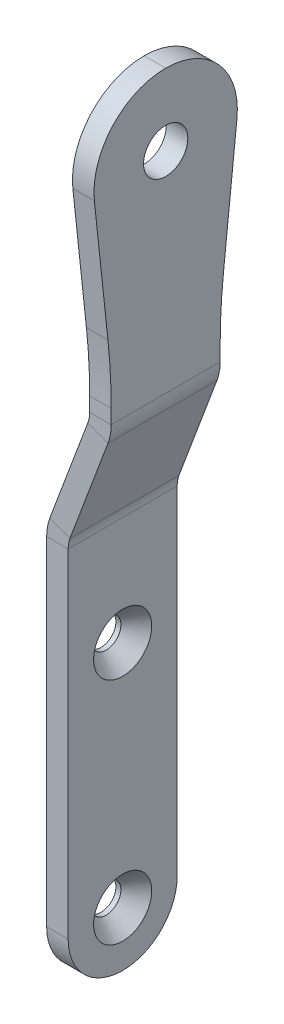
ISO-10303-21;
HEADER;
FILE_DESCRIPTION(('STEP AP214'),'2;1');
FILE_NAME('part.step','',(''),(''),'','','');
FILE_SCHEMA(('AUTOMOTIVE_DESIGN { 1 0 10303 214 1 1 1 1 }'));
ENDSEC;
DATA;
#1=APPLICATION_CONTEXT('core data for automotive mechanical design processes');
#2=APPLICATION_PROTOCOL_DEFINITION('international standard','automotive_design',2000,#1);
#3=PRODUCT_CONTEXT('',#1,'mechanical');
#4=PRODUCT('Part','Part','',(#3));
#5=PRODUCT_RELATED_PRODUCT_CATEGORY('part','',(#4));
#6=PRODUCT_DEFINITION_FORMATION('','',#4);
#7=PRODUCT_DEFINITION_CONTEXT('part definition',#1,'design');
#8=PRODUCT_DEFINITION('design','',#6,#7);
#9=PRODUCT_DEFINITION_SHAPE('','',#8);
#10=(LENGTH_UNIT() NAMED_UNIT(*) SI_UNIT(.MILLI.,.METRE.));
#11=(NAMED_UNIT(*) PLANE_ANGLE_UNIT() SI_UNIT($,.RADIAN.));
#12=(NAMED_UNIT(*) SI_UNIT($,.STERADIAN.) SOLID_ANGLE_UNIT());
#13=UNCERTAINTY_MEASURE_WITH_UNIT(LENGTH_MEASURE(1.E-05),#10,'distance_accuracy_value','');
#14=(GEOMETRIC_REPRESENTATION_CONTEXT(3) GLOBAL_UNCERTAINTY_ASSIGNED_CONTEXT((#13)) GLOBAL_UNIT_ASSIGNED_CONTEXT((#10,
#11,#12)) REPRESENTATION_CONTEXT('',''));
#15=CARTESIAN_POINT('',(0.,0.,0.));
#16=DIRECTION('',(0.,0.,1.));
#17=DIRECTION('',(1.,0.,0.));
#18=AXIS2_PLACEMENT_3D('',#15,#16,#17);
#19=CARTESIAN_POINT('',(-26.4404109289541,4.82859740108271,27.94));
#20=DIRECTION('',(0.,0.,1.));
#21=DIRECTION('',(0.936329177569045,-0.351123441588391,0.));
#22=AXIS2_PLACEMENT_3D('',#19,#20,#21);
#23=PLANE('',#22);
#24=DIRECTION('',(0.936329177569046,-0.351123441588388,0.));
#25=VECTOR('',#24,1.);
#26=CARTESIAN_POINT('',(9.12069027756343,113.221840740169,27.94));
#27=LINE('',#26,#25);
#28=CARTESIAN_POINT('',(9.12069027756344,113.221840740169,27.94));
#29=VERTEX_POINT('',#28);
#30=CARTESIAN_POINT('',(13.579957985736,111.549615349604,27.94));
#31=VERTEX_POINT('',#30);
#32=EDGE_CURVE('E351',#29,#31,#27,.T.);
#33=ORIENTED_EDGE('',*,*,#32,.F.);
#34=DIRECTION('',(0.351123441588392,0.936329177569045,0.));
#35=VECTOR('',#34,1.);
#36=CARTESIAN_POINT('',(0.,88.9,27.94));
#37=LINE('',#36,#35);
#38=CARTESIAN_POINT('',(0.70754201426395,90.7867787047039,27.94));
#39=VERTEX_POINT('',#38);
#40=EDGE_CURVE('E334',#39,#29,#37,.T.);
#41=ORIENTED_EDGE('',*,*,#40,.F.);
#42=DIRECTION('',(-0.936329177569045,0.351123441588391,0.));
#43=VECTOR('',#42,1.);
#44=CARTESIAN_POINT('',(5.16680972243652,89.1145533141392,27.94));
#45=LINE('',#44,#43);
#46=CARTESIAN_POINT('',(5.16680972243652,89.1145533141392,27.94));
#47=VERTEX_POINT('',#46);
#48=EDGE_CURVE('E347',#47,#39,#45,.T.);
#49=ORIENTED_EDGE('',*,*,#48,.F.);
#50=DIRECTION('',(0.351123441588392,0.936329177569045,0.));
#51=VECTOR('',#50,1.);
#52=CARTESIAN_POINT('',(4.45926770817256,87.2277746094353,27.94));
#53=LINE('',#52,#51);
#54=EDGE_CURVE('E58',#47,#31,#53,.T.);
#55=ORIENTED_EDGE('',*,*,#54,.T.);
#56=EDGE_LOOP('',(#33,#41,#49,#55));
#57=FACE_BOUND('',#56,.T.);
#58=ADVANCED_FACE('F43',(#57),#23,.T.);
#59=CARTESIAN_POINT('',(-26.4404109289541,4.82859740108271,3.81));
#60=DIRECTION('',(0.,0.,-1.));
#61=DIRECTION('',(0.351123441588391,0.936329177569045,0.));
#62=AXIS2_PLACEMENT_3D('',#59,#60,#61);
#63=PLANE('',#62);
#64=DIRECTION('',(-0.936329177569046,0.351123441588388,0.));
#65=VECTOR('',#64,1.);
#66=CARTESIAN_POINT('',(13.579957985736,111.549615349604,3.81));
#67=LINE('',#66,#65);
#68=CARTESIAN_POINT('',(13.579957985736,111.549615349604,3.81));
#69=VERTEX_POINT('',#68);
#70=CARTESIAN_POINT('',(9.12069027756343,113.221840740169,3.81));
#71=VERTEX_POINT('',#70);
#72=EDGE_CURVE('E11',#69,#71,#67,.T.);
#73=ORIENTED_EDGE('',*,*,#72,.F.);
#74=DIRECTION('',(-0.351123441588392,-0.936329177569045,0.));
#75=VECTOR('',#74,1.);
#76=CARTESIAN_POINT('',(4.45926770817256,87.2277746094353,3.81));
#77=LINE('',#76,#75);
#78=CARTESIAN_POINT('',(5.16680972243652,89.1145533141392,3.81));
#79=VERTEX_POINT('',#78);
#80=EDGE_CURVE('E66',#69,#79,#77,.T.);
#81=ORIENTED_EDGE('',*,*,#80,.T.);
#82=DIRECTION('',(0.936329177569045,-0.351123441588391,0.));
#83=VECTOR('',#82,1.);
#84=CARTESIAN_POINT('',(0.70754201426395,90.7867787047039,3.81));
#85=LINE('',#84,#83);
#86=CARTESIAN_POINT('',(0.70754201426395,90.7867787047039,3.81));
#87=VERTEX_POINT('',#86);
#88=EDGE_CURVE('E342',#87,#79,#85,.T.);
#89=ORIENTED_EDGE('',*,*,#88,.F.);
#90=DIRECTION('',(-0.351123441588392,-0.936329177569045,0.));
#91=VECTOR('',#90,1.);
#92=CARTESIAN_POINT('',(0.,88.9,3.81));
#93=LINE('',#92,#91);
#94=EDGE_CURVE('E337',#71,#87,#93,.T.);
#95=ORIENTED_EDGE('',*,*,#94,.F.);
#96=EDGE_LOOP('',(#73,#81,#89,#95));
#97=FACE_BOUND('',#96,.T.);
#98=ADVANCED_FACE('F45',(#97),#63,.T.);
#99=CARTESIAN_POINT('',(0.,88.9,31.75));
#100=DIRECTION('',(-0.936329177569045,0.351123441588392,0.));
#101=DIRECTION('',(-0.351123441588392,-0.936329177569045,0.));
#102=AXIS2_PLACEMENT_3D('',#99,#100,#101);
#103=PLANE('',#102);
#104=DIRECTION('',(0.,0.,-1.));
#105=VECTOR('',#104,1.);
#106=CARTESIAN_POINT('',(9.12069027756343,113.221840740169,31.75));
#107=LINE('',#106,#105);
#108=EDGE_CURVE('E202',#29,#71,#107,.T.);
#109=ORIENTED_EDGE('',*,*,#108,.T.);
#110=ORIENTED_EDGE('',*,*,#94,.T.);
#111=DIRECTION('',(0.,0.,-1.));
#112=VECTOR('',#111,1.);
#113=CARTESIAN_POINT('',(0.70754201426395,90.7867787047039,31.75));
#114=LINE('',#113,#112);
#115=EDGE_CURVE('E339',#39,#87,#114,.T.);
#116=ORIENTED_EDGE('',*,*,#115,.F.);
#117=ORIENTED_EDGE('',*,*,#40,.T.);
#118=EDGE_LOOP('',(#109,#110,#116,#117));
#119=FACE_BOUND('',#118,.T.);
#120=ADVANCED_FACE('F361',(#119),#103,.T.);
#121=CARTESIAN_POINT('',(4.45926770817256,87.2277746094353,31.75));
#122=DIRECTION('',(-0.936329177569045,0.351123441588392,0.));
#123=DIRECTION('',(-0.351123441588392,-0.936329177569045,0.));
#124=AXIS2_PLACEMENT_3D('',#121,#122,#123);
#125=PLANE('',#124);
#126=ORIENTED_EDGE('',*,*,#80,.F.);
#127=DIRECTION('',(0.,0.,-1.));
#128=VECTOR('',#127,1.);
#129=CARTESIAN_POINT('',(13.579957985736,111.549615349604,31.75));
#130=LINE('',#129,#128);
#131=EDGE_CURVE('E51',#31,#69,#130,.T.);
#132=ORIENTED_EDGE('',*,*,#131,.F.);
#133=ORIENTED_EDGE('',*,*,#54,.F.);
#134=DIRECTION('',(0.,0.,-1.));
#135=VECTOR('',#134,1.);
#136=CARTESIAN_POINT('',(5.16680972243653,89.1145533141392,31.75));
#137=LINE('',#136,#135);
#138=EDGE_CURVE('E345',#47,#79,#137,.T.);
#139=ORIENTED_EDGE('',*,*,#138,.T.);
#140=EDGE_LOOP('',(#126,#132,#133,#139));
#141=FACE_BOUND('',#140,.T.);
#142=ADVANCED_FACE('F358',(#141),#125,.F.);
#143=CARTESIAN_POINT('',(11.1125,86.8849194600529,3.81));
#144=DIRECTION('',(0.,0.,-1.));
#145=DIRECTION('',(-0.936329177569045,0.351123441588391,0.));
#146=AXIS2_PLACEMENT_3D('',#143,#144,#145);
#147=PLANE('',#146);
#148=ORIENTED_EDGE('',*,*,#88,.T.);
#149=CARTESIAN_POINT('',(11.1125,86.8849194600529,3.81));
#150=DIRECTION('',(0.,0.,1.));
#151=DIRECTION('',(0.936329177569045,-0.351123441588391,0.));
#152=AXIS2_PLACEMENT_3D('',#149,#150,#151);
#153=CIRCLE('',#152,6.35);
#154=CARTESIAN_POINT('',(4.76249999999995,86.8849194600529,3.81));
#155=VERTEX_POINT('',#154);
#156=EDGE_CURVE('E273',#79,#155,#153,.T.);
#157=ORIENTED_EDGE('',*,*,#156,.T.);
#158=DIRECTION('',(-1.,0.,0.));
#159=VECTOR('',#158,1.);
#160=CARTESIAN_POINT('',(4.76249999999995,86.8849194600529,3.81));
#161=LINE('',#160,#159);
#162=CARTESIAN_POINT('',(0.,86.8849194600529,3.81));
#163=VERTEX_POINT('',#162);
#164=EDGE_CURVE('E314',#155,#163,#161,.T.);
#165=ORIENTED_EDGE('',*,*,#164,.T.);
#166=CARTESIAN_POINT('',(11.1125,86.8849194600529,3.81));
#167=DIRECTION('',(0.,0.,1.));
#168=DIRECTION('',(0.936329177569045,-0.351123441588391,0.));
#169=AXIS2_PLACEMENT_3D('',#166,#167,#168);
#170=CIRCLE('',#169,11.1125);
#171=EDGE_CURVE('E322',#87,#163,#170,.T.);
#172=ORIENTED_EDGE('',*,*,#171,.F.);
#173=EDGE_LOOP('',(#148,#157,#165,#172));
#174=FACE_BOUND('',#173,.T.);
#175=ADVANCED_FACE('F385',(#174),#147,.T.);
#176=CARTESIAN_POINT('',(11.1125,86.8849194600529,27.94));
#177=DIRECTION('',(0.,0.,1.));
#178=DIRECTION('',(0.936329177569045,-0.351123441588391,0.));
#179=AXIS2_PLACEMENT_3D('',#176,#177,#178);
#180=PLANE('',#179);
#181=CARTESIAN_POINT('',(11.1125,86.8849194600529,27.94));
#182=DIRECTION('',(0.,0.,1.));
#183=DIRECTION('',(0.936329177569045,-0.351123441588391,0.));
#184=AXIS2_PLACEMENT_3D('',#181,#182,#183);
#185=CIRCLE('',#184,6.35);
#186=CARTESIAN_POINT('',(4.76249999999995,86.8849194600529,27.94));
#187=VERTEX_POINT('',#186);
#188=EDGE_CURVE('E326',#187,#47,#185,.F.);
#189=ORIENTED_EDGE('',*,*,#188,.T.);
#190=ORIENTED_EDGE('',*,*,#48,.T.);
#191=CARTESIAN_POINT('',(11.1125,86.8849194600529,27.94));
#192=DIRECTION('',(0.,0.,-1.));
#193=DIRECTION('',(-0.936329177569045,0.351123441588391,0.));
#194=AXIS2_PLACEMENT_3D('',#191,#192,#193);
#195=CIRCLE('',#194,11.1125);
#196=CARTESIAN_POINT('',(0.,86.8849194600529,27.94));
#197=VERTEX_POINT('',#196);
#198=EDGE_CURVE('E325',#197,#39,#195,.T.);
#199=ORIENTED_EDGE('',*,*,#198,.F.);
#200=DIRECTION('',(1.,0.,0.));
#201=VECTOR('',#200,1.);
#202=CARTESIAN_POINT('',(0.,86.8849194600529,27.94));
#203=LINE('',#202,#201);
#204=EDGE_CURVE('E213',#197,#187,#203,.T.);
#205=ORIENTED_EDGE('',*,*,#204,.T.);
#206=EDGE_LOOP('',(#189,#190,#199,#205));
#207=FACE_BOUND('',#206,.T.);
#208=ADVANCED_FACE('F371',(#207),#180,.T.);
#209=CARTESIAN_POINT('',(11.1125,86.8849194600529,-8.91917200349693));
#210=DIRECTION('',(0.,0.,1.));
#211=DIRECTION('',(0.936329177569045,-0.351123441588391,0.));
#212=AXIS2_PLACEMENT_3D('',#209,#210,#211);
#213=CYLINDRICAL_SURFACE('',#212,11.1125);
#214=DIRECTION('',(0.,0.,-1.));
#215=VECTOR('',#214,1.);
#216=CARTESIAN_POINT('',(0.,86.8849194600529,31.75));
#217=LINE('',#216,#215);
#218=EDGE_CURVE('E285',#197,#163,#217,.T.);
#219=ORIENTED_EDGE('',*,*,#218,.F.);
#220=ORIENTED_EDGE('',*,*,#198,.T.);
#221=ORIENTED_EDGE('',*,*,#115,.T.);
#222=ORIENTED_EDGE('',*,*,#171,.T.);
#223=EDGE_LOOP('',(#219,#220,#221,#222));
#224=FACE_BOUND('',#223,.T.);
#225=ADVANCED_FACE('F382',(#224),#213,.T.);
#226=CARTESIAN_POINT('',(11.1125,86.8849194600529,-8.91917200349693));
#227=DIRECTION('',(0.,0.,1.));
#228=DIRECTION('',(0.936329177569045,-0.351123441588391,0.));
#229=AXIS2_PLACEMENT_3D('',#226,#227,#228);
#230=CYLINDRICAL_SURFACE('',#229,6.35);
#231=DIRECTION('',(0.,0.,-1.));
#232=VECTOR('',#231,1.);
#233=CARTESIAN_POINT('',(4.76249999999995,86.8849194600529,31.75));
#234=LINE('',#233,#232);
#235=EDGE_CURVE('E317',#187,#155,#234,.T.);
#236=ORIENTED_EDGE('',*,*,#235,.T.);
#237=ORIENTED_EDGE('',*,*,#156,.F.);
#238=ORIENTED_EDGE('',*,*,#138,.F.);
#239=ORIENTED_EDGE('',*,*,#188,.F.);
#240=EDGE_LOOP('',(#236,#237,#238,#239));
#241=FACE_BOUND('',#240,.T.);
#242=ADVANCED_FACE('F370',(#241),#230,.F.);
#243=CARTESIAN_POINT('',(4.76249999999996,12.0649999999999,15.875));
#244=DIRECTION('',(1.,0.,0.));
#245=DIRECTION('',(0.,0.,-1.));
#246=AXIS2_PLACEMENT_3D('',#243,#244,#245);
#247=CONICAL_SURFACE('',#246,6.4389,0.715584993317675);
#248=CARTESIAN_POINT('',(1.11008030707325,12.0649999999999,15.875));
#249=DIRECTION('',(1.,0.,0.));
#250=DIRECTION('',(0.,0.,-1.));
#251=AXIS2_PLACEMENT_3D('',#248,#249,#250);
#252=CIRCLE('',#251,3.2639);
#253=CARTESIAN_POINT('',(1.11008030707325,12.0649999999999,12.6111));
#254=VERTEX_POINT('',#253);
#255=EDGE_CURVE('E305',#254,#254,#252,.T.);
#256=ORIENTED_EDGE('',*,*,#255,.F.);
#257=EDGE_LOOP('',(#256));
#258=FACE_BOUND('',#257,.T.);
#259=CARTESIAN_POINT('',(4.76249999999996,12.0649999999999,15.875));
#260=DIRECTION('',(1.,0.,0.));
#261=DIRECTION('',(0.,0.,-1.));
#262=AXIS2_PLACEMENT_3D('',#259,#260,#261);
#263=CIRCLE('',#262,6.4389);
#264=CARTESIAN_POINT('',(4.76249999999996,12.0649999999999,9.4361));
#265=VERTEX_POINT('',#264);
#266=EDGE_CURVE('E311',#265,#265,#263,.T.);
#267=ORIENTED_EDGE('',*,*,#266,.T.);
#268=EDGE_LOOP('',(#267));
#269=FACE_BOUND('',#268,.T.);
#270=ADVANCED_FACE('F406',(#258,#269),#247,.F.);
#271=CARTESIAN_POINT('',(4.76249999999989,62.865,15.875));
#272=DIRECTION('',(1.,0.,0.));
#273=DIRECTION('',(0.,0.,-1.));
#274=AXIS2_PLACEMENT_3D('',#271,#272,#273);
#275=CONICAL_SURFACE('',#274,6.4389,0.715584993317675);
#276=CARTESIAN_POINT('',(1.11008030707319,62.865,15.875));
#277=DIRECTION('',(1.,0.,0.));
#278=DIRECTION('',(0.,0.,-1.));
#279=AXIS2_PLACEMENT_3D('',#276,#277,#278);
#280=CIRCLE('',#279,3.2639);
#281=CARTESIAN_POINT('',(1.11008030707319,62.865,12.6111));
#282=VERTEX_POINT('',#281);
#283=EDGE_CURVE('E302',#282,#282,#280,.T.);
#284=ORIENTED_EDGE('',*,*,#283,.F.);
#285=EDGE_LOOP('',(#284));
#286=FACE_BOUND('',#285,.T.);
#287=CARTESIAN_POINT('',(4.76249999999989,62.865,15.875));
#288=DIRECTION('',(1.,0.,0.));
#289=DIRECTION('',(0.,0.,-1.));
#290=AXIS2_PLACEMENT_3D('',#287,#288,#289);
#291=CIRCLE('',#290,6.4389);
#292=CARTESIAN_POINT('',(4.76249999999989,62.865,9.4361));
#293=VERTEX_POINT('',#292);
#294=EDGE_CURVE('E308',#293,#293,#291,.T.);
#295=ORIENTED_EDGE('',*,*,#294,.T.);
#296=EDGE_LOOP('',(#295));
#297=FACE_BOUND('',#296,.T.);
#298=ADVANCED_FACE('F397',(#286,#297),#275,.F.);
#299=CARTESIAN_POINT('',(0.,12.0649999999999,15.875));
#300=DIRECTION('',(-1.,0.,0.));
#301=DIRECTION('',(0.,-1.,0.));
#302=AXIS2_PLACEMENT_3D('',#299,#300,#301);
#303=CYLINDRICAL_SURFACE('',#302,12.065);
#304=DIRECTION('',(-1.,0.,0.));
#305=VECTOR('',#304,1.);
#306=CARTESIAN_POINT('',(4.76251199999996,12.0649999999999,27.94));
#307=LINE('',#306,#305);
#308=CARTESIAN_POINT('',(0.,12.0649999999999,27.94));
#309=VERTEX_POINT('',#308);
#310=CARTESIAN_POINT('',(4.76249999999996,12.0649999999999,27.94));
#311=VERTEX_POINT('',#310);
#312=EDGE_CURVE('E274',#309,#311,#307,.F.);
#313=ORIENTED_EDGE('',*,*,#312,.F.);
#314=CARTESIAN_POINT('',(0.,12.0649999999999,15.875));
#315=DIRECTION('',(-1.,0.,0.));
#316=DIRECTION('',(0.,-1.,0.));
#317=AXIS2_PLACEMENT_3D('',#314,#315,#316);
#318=CIRCLE('',#317,12.065);
#319=CARTESIAN_POINT('',(0.,12.0649999999999,3.81));
#320=VERTEX_POINT('',#319);
#321=EDGE_CURVE('E291',#320,#309,#318,.T.);
#322=ORIENTED_EDGE('',*,*,#321,.F.);
#323=DIRECTION('',(-1.,0.,0.));
#324=VECTOR('',#323,1.);
#325=CARTESIAN_POINT('',(4.76251199999996,12.0649999999999,3.81));
#326=LINE('',#325,#324);
#327=CARTESIAN_POINT('',(4.76249999999995,12.065,3.81));
#328=VERTEX_POINT('',#327);
#329=EDGE_CURVE('E279',#328,#320,#326,.T.);
#330=ORIENTED_EDGE('',*,*,#329,.F.);
#331=CARTESIAN_POINT('',(4.76249999999996,12.0649999999999,15.875));
#332=DIRECTION('',(-1.,0.,0.));
#333=DIRECTION('',(0.,-1.,0.));
#334=AXIS2_PLACEMENT_3D('',#331,#332,#333);
#335=CIRCLE('',#334,12.065);
#336=EDGE_CURVE('E277',#311,#328,#335,.F.);
#337=ORIENTED_EDGE('',*,*,#336,.F.);
#338=EDGE_LOOP('',(#313,#322,#330,#337));
#339=FACE_BOUND('',#338,.T.);
#340=ADVANCED_FACE('F394',(#339),#303,.T.);
#341=CARTESIAN_POINT('',(4.76249999999996,12.0649999999999,15.875));
#342=DIRECTION('',(1.,0.,0.));
#343=DIRECTION('',(0.,0.,-1.));
#344=AXIS2_PLACEMENT_3D('',#341,#342,#343);
#345=CYLINDRICAL_SURFACE('',#344,3.2639);
#346=CARTESIAN_POINT('',(-1.94289029309402E-13,12.0649999999999,15.875));
#347=DIRECTION('',(1.,0.,0.));
#348=DIRECTION('',(0.,0.,-1.));
#349=AXIS2_PLACEMENT_3D('',#346,#347,#348);
#350=CIRCLE('',#349,3.2639);
#351=CARTESIAN_POINT('',(-1.94289029309402E-13,12.0649999999999,12.6111));
#352=VERTEX_POINT('',#351);
#353=EDGE_CURVE('E296',#352,#352,#350,.T.);
#354=ORIENTED_EDGE('',*,*,#353,.F.);
#355=EDGE_LOOP('',(#354));
#356=FACE_BOUND('',#355,.T.);
#357=ORIENTED_EDGE('',*,*,#255,.T.);
#358=EDGE_LOOP('',(#357));
#359=FACE_BOUND('',#358,.T.);
#360=ADVANCED_FACE('F396',(#356,#359),#345,.F.);
#361=CARTESIAN_POINT('',(4.76249999999989,62.865,15.875));
#362=DIRECTION('',(1.,0.,0.));
#363=DIRECTION('',(0.,0.,-1.));
#364=AXIS2_PLACEMENT_3D('',#361,#362,#363);
#365=CYLINDRICAL_SURFACE('',#364,3.2639);
#366=CARTESIAN_POINT('',(-2.63677968348475E-13,62.865,15.875));
#367=DIRECTION('',(1.,0.,0.));
#368=DIRECTION('',(0.,0.,-1.));
#369=AXIS2_PLACEMENT_3D('',#366,#367,#368);
#370=CIRCLE('',#369,3.2639);
#371=CARTESIAN_POINT('',(-2.63677968348475E-13,62.865,12.6111));
#372=VERTEX_POINT('',#371);
#373=EDGE_CURVE('E299',#372,#372,#370,.T.);
#374=ORIENTED_EDGE('',*,*,#373,.F.);
#375=EDGE_LOOP('',(#374));
#376=FACE_BOUND('',#375,.T.);
#377=ORIENTED_EDGE('',*,*,#283,.T.);
#378=EDGE_LOOP('',(#377));
#379=FACE_BOUND('',#378,.T.);
#380=ADVANCED_FACE('F403',(#376,#379),#365,.F.);
#381=CARTESIAN_POINT('',(0.,0.,31.75));
#382=DIRECTION('',(-1.,0.,0.));
#383=DIRECTION('',(0.,0.,1.));
#384=AXIS2_PLACEMENT_3D('',#381,#382,#383);
#385=PLANE('',#384);
#386=ORIENTED_EDGE('',*,*,#373,.T.);
#387=EDGE_LOOP('',(#386));
#388=FACE_BOUND('',#387,.T.);
#389=ORIENTED_EDGE('',*,*,#353,.T.);
#390=EDGE_LOOP('',(#389));
#391=FACE_BOUND('',#390,.T.);
#392=DIRECTION('',(0.,-1.,0.));
#393=VECTOR('',#392,1.);
#394=CARTESIAN_POINT('',(0.,0.,3.81));
#395=LINE('',#394,#393);
#396=EDGE_CURVE('E293',#163,#320,#395,.T.);
#397=ORIENTED_EDGE('',*,*,#396,.T.);
#398=ORIENTED_EDGE('',*,*,#321,.T.);
#399=DIRECTION('',(0.,1.,0.));
#400=VECTOR('',#399,1.);
#401=CARTESIAN_POINT('',(0.,0.,27.94));
#402=LINE('',#401,#400);
#403=EDGE_CURVE('E288',#309,#197,#402,.T.);
#404=ORIENTED_EDGE('',*,*,#403,.T.);
#405=ORIENTED_EDGE('',*,*,#218,.T.);
#406=EDGE_LOOP('',(#397,#398,#404,#405));
#407=FACE_BOUND('',#406,.T.);
#408=ADVANCED_FACE('F379',(#388,#391,#407),#385,.T.);
#409=CARTESIAN_POINT('',(4.76251199999995,0.,3.81));
#410=DIRECTION('',(0.,0.,-1.));
#411=DIRECTION('',(0.,1.,0.));
#412=AXIS2_PLACEMENT_3D('',#409,#410,#411);
#413=PLANE('',#412);
#414=ORIENTED_EDGE('',*,*,#164,.F.);
#415=DIRECTION('',(0.,-1.,0.));
#416=VECTOR('',#415,1.);
#417=CARTESIAN_POINT('',(4.76249999999995,0.,3.81));
#418=LINE('',#417,#416);
#419=EDGE_CURVE('E282',#155,#328,#418,.T.);
#420=ORIENTED_EDGE('',*,*,#419,.T.);
#421=ORIENTED_EDGE('',*,*,#329,.T.);
#422=ORIENTED_EDGE('',*,*,#396,.F.);
#423=EDGE_LOOP('',(#414,#420,#421,#422));
#424=FACE_BOUND('',#423,.T.);
#425=ADVANCED_FACE('F388',(#424),#413,.T.);
#426=CARTESIAN_POINT('',(4.76249999999995,0.,31.75));
#427=DIRECTION('',(-1.,0.,0.));
#428=DIRECTION('',(0.,0.,1.));
#429=AXIS2_PLACEMENT_3D('',#426,#427,#428);
#430=PLANE('',#429);
#431=ORIENTED_EDGE('',*,*,#294,.F.);
#432=EDGE_LOOP('',(#431));
#433=FACE_BOUND('',#432,.T.);
#434=DIRECTION('',(0.,1.,0.));
#435=VECTOR('',#434,1.);
#436=CARTESIAN_POINT('',(4.76249999999995,0.,27.94));
#437=LINE('',#436,#435);
#438=EDGE_CURVE('E271',#311,#187,#437,.T.);
#439=ORIENTED_EDGE('',*,*,#438,.F.);
#440=ORIENTED_EDGE('',*,*,#336,.T.);
#441=ORIENTED_EDGE('',*,*,#419,.F.);
#442=ORIENTED_EDGE('',*,*,#235,.F.);
#443=EDGE_LOOP('',(#439,#440,#441,#442));
#444=FACE_BOUND('',#443,.T.);
#445=ORIENTED_EDGE('',*,*,#266,.F.);
#446=EDGE_LOOP('',(#445));
#447=FACE_BOUND('',#446,.T.);
#448=ADVANCED_FACE('F390',(#433,#444,#447),#430,.F.);
#449=CARTESIAN_POINT('',(4.76251199999995,0.,27.94));
#450=DIRECTION('',(0.,0.,1.));
#451=DIRECTION('',(1.,0.,0.));
#452=AXIS2_PLACEMENT_3D('',#449,#450,#451);
#453=PLANE('',#452);
#454=ORIENTED_EDGE('',*,*,#204,.F.);
#455=ORIENTED_EDGE('',*,*,#403,.F.);
#456=ORIENTED_EDGE('',*,*,#312,.T.);
#457=ORIENTED_EDGE('',*,*,#438,.T.);
#458=EDGE_LOOP('',(#454,#455,#456,#457));
#459=FACE_BOUND('',#458,.T.);
#460=ADVANCED_FACE('F374',(#459),#453,.T.);
#461=CARTESIAN_POINT('',(3.17500000000028,161.925,15.875));
#462=DIRECTION('',(1.,0.,0.));
#463=DIRECTION('',(0.,1.,0.));
#464=AXIS2_PLACEMENT_3D('',#461,#462,#463);
#465=CYLINDRICAL_SURFACE('',#464,15.875);
#466=CARTESIAN_POINT('',(14.2875,161.925,15.875));
#467=DIRECTION('',(-1.,0.,0.));
#468=DIRECTION('',(0.,0.,1.));
#469=AXIS2_PLACEMENT_3D('',#466,#467,#468);
#470=CIRCLE('',#469,15.875);
#471=CARTESIAN_POINT('',(14.2875,160.242225537365,0.0894402979209272));
#472=VERTEX_POINT('',#471);
#473=CARTESIAN_POINT('',(14.2875,177.8,15.875));
#474=VERTEX_POINT('',#473);
#475=EDGE_CURVE('E227',#472,#474,#470,.F.);
#476=ORIENTED_EDGE('',*,*,#475,.F.);
#477=DIRECTION('',(1.,0.,0.));
#478=VECTOR('',#477,1.);
#479=CARTESIAN_POINT('',(4.12750000000006,160.242225537365,0.0894402979209306));
#480=LINE('',#479,#478);
#481=CARTESIAN_POINT('',(9.525,160.242225537365,0.0894402979209306));
#482=VERTEX_POINT('',#481);
#483=EDGE_CURVE('E251',#482,#472,#480,.T.);
#484=ORIENTED_EDGE('',*,*,#483,.F.);
#485=CARTESIAN_POINT('',(9.525,161.925,15.875));
#486=DIRECTION('',(-1.,0.,0.));
#487=DIRECTION('',(0.,0.,1.));
#488=AXIS2_PLACEMENT_3D('',#485,#486,#487);
#489=CIRCLE('',#488,15.875);
#490=CARTESIAN_POINT('',(9.525,177.8,15.875));
#491=VERTEX_POINT('',#490);
#492=EDGE_CURVE('E236',#491,#482,#489,.T.);
#493=ORIENTED_EDGE('',*,*,#492,.F.);
#494=DIRECTION('',(1.,0.,0.));
#495=VECTOR('',#494,1.);
#496=CARTESIAN_POINT('',(9.525,177.8,15.875));
#497=LINE('',#496,#495);
#498=EDGE_CURVE('E264',#474,#491,#497,.F.);
#499=ORIENTED_EDGE('',*,*,#498,.F.);
#500=EDGE_LOOP('',(#476,#484,#493,#499));
#501=FACE_BOUND('',#500,.T.);
#502=ADVANCED_FACE('F429',(#501),#465,.T.);
#503=CARTESIAN_POINT('',(9.52499999999991,161.925,15.875));
#504=DIRECTION('',(1.,0.,0.));
#505=DIRECTION('',(0.,1.,0.));
#506=AXIS2_PLACEMENT_3D('',#503,#504,#505);
#507=CYLINDRICAL_SURFACE('',#506,15.875);
#508=CARTESIAN_POINT('',(9.525,161.925,15.875));
#509=DIRECTION('',(-1.,0.,0.));
#510=DIRECTION('',(0.,0.,1.));
#511=AXIS2_PLACEMENT_3D('',#508,#509,#510);
#512=CIRCLE('',#511,15.875);
#513=CARTESIAN_POINT('',(9.525,160.242225537365,31.6605597020791));
#514=VERTEX_POINT('',#513);
#515=EDGE_CURVE('E239',#514,#491,#512,.T.);
#516=ORIENTED_EDGE('',*,*,#515,.F.);
#517=DIRECTION('',(1.,0.,0.));
#518=VECTOR('',#517,1.);
#519=CARTESIAN_POINT('',(4.12750000000006,160.242225537365,31.6605597020791));
#520=LINE('',#519,#518);
#521=CARTESIAN_POINT('',(14.2875,160.242225537365,31.6605597020791));
#522=VERTEX_POINT('',#521);
#523=EDGE_CURVE('E198',#514,#522,#520,.T.);
#524=ORIENTED_EDGE('',*,*,#523,.T.);
#525=CARTESIAN_POINT('',(14.2875,161.925,15.875));
#526=DIRECTION('',(-1.,0.,0.));
#527=DIRECTION('',(0.,0.,1.));
#528=AXIS2_PLACEMENT_3D('',#525,#526,#527);
#529=CIRCLE('',#528,15.875);
#530=EDGE_CURVE('E225',#474,#522,#529,.F.);
#531=ORIENTED_EDGE('',*,*,#530,.F.);
#532=ORIENTED_EDGE('',*,*,#498,.T.);
#533=EDGE_LOOP('',(#516,#524,#531,#532));
#534=FACE_BOUND('',#533,.T.);
#535=ADVANCED_FACE('F491',(#534),#507,.T.);
#536=CARTESIAN_POINT('',(4.12750000000001,125.340865547422,27.94));
#537=DIRECTION('',(0.,0.106001540953408,-0.994365965485295));
#538=DIRECTION('',(0.,0.994365965485295,0.106001540953408));
#539=AXIS2_PLACEMENT_3D('',#536,#537,#538);
#540=PLANE('',#539);
#541=DIRECTION('',(0.,-0.994365965485295,-0.106001540953408));
#542=VECTOR('',#541,1.);
#543=CARTESIAN_POINT('',(9.525,114.825649248946,26.8190554284983));
#544=LINE('',#543,#542);
#545=CARTESIAN_POINT('',(9.525,132.052948213053,28.6555223833675));
#546=VERTEX_POINT('',#545);
#547=EDGE_CURVE('E261',#514,#546,#544,.T.);
#548=ORIENTED_EDGE('',*,*,#547,.T.);
#549=DIRECTION('',(1.,0.,0.));
#550=VECTOR('',#549,1.);
#551=CARTESIAN_POINT('',(4.12750000000002,132.052948213053,28.6555223833675));
#552=LINE('',#551,#550);
#553=CARTESIAN_POINT('',(14.2875,132.052948213053,28.6555223833675));
#554=VERTEX_POINT('',#553);
#555=EDGE_CURVE('E258',#546,#554,#552,.T.);
#556=ORIENTED_EDGE('',*,*,#555,.T.);
#557=DIRECTION('',(0.,-0.994365965485295,-0.106001540953408));
#558=VECTOR('',#557,1.);
#559=CARTESIAN_POINT('',(14.2875,160.242225537365,31.6605597020791));
#560=LINE('',#559,#558);
#561=EDGE_CURVE('E222',#522,#554,#560,.T.);
#562=ORIENTED_EDGE('',*,*,#561,.F.);
#563=ORIENTED_EDGE('',*,*,#523,.F.);
#564=EDGE_LOOP('',(#548,#556,#562,#563));
#565=FACE_BOUND('',#564,.T.);
#566=ADVANCED_FACE('F487',(#565),#540,.F.);
#567=CARTESIAN_POINT('',(4.1275,118.59075251197,154.94));
#568=DIRECTION('',(1.,0.,0.));
#569=DIRECTION('',(0.,1.,0.));
#570=AXIS2_PLACEMENT_3D('',#567,#568,#569);
#571=CYLINDRICAL_SURFACE('',#570,127.);
#572=CARTESIAN_POINT('',(9.525,118.59075251197,154.94));
#573=DIRECTION('',(-1.,0.,0.));
#574=DIRECTION('',(0.,0.,1.));
#575=AXIS2_PLACEMENT_3D('',#572,#573,#574);
#576=CIRCLE('',#575,127.);
#577=CARTESIAN_POINT('',(9.525,118.59075251197,27.94));
#578=VERTEX_POINT('',#577);
#579=EDGE_CURVE('E189',#578,#546,#576,.F.);
#580=ORIENTED_EDGE('',*,*,#579,.F.);
#581=DIRECTION('',(1.,0.,0.));
#582=VECTOR('',#581,1.);
#583=CARTESIAN_POINT('',(14.287512,118.59075251197,27.94));
#584=LINE('',#583,#582);
#585=CARTESIAN_POINT('',(14.2875,118.59075251197,27.94));
#586=VERTEX_POINT('',#585);
#587=EDGE_CURVE('E188',#586,#578,#584,.F.);
#588=ORIENTED_EDGE('',*,*,#587,.F.);
#589=CARTESIAN_POINT('',(14.2875,118.59075251197,154.94));
#590=DIRECTION('',(-1.,0.,0.));
#591=DIRECTION('',(0.,0.,1.));
#592=AXIS2_PLACEMENT_3D('',#589,#590,#591);
#593=CIRCLE('',#592,127.);
#594=EDGE_CURVE('E220',#554,#586,#593,.T.);
#595=ORIENTED_EDGE('',*,*,#594,.F.);
#596=ORIENTED_EDGE('',*,*,#555,.F.);
#597=EDGE_LOOP('',(#580,#588,#595,#596));
#598=FACE_BOUND('',#597,.T.);
#599=ADVANCED_FACE('F483',(#598),#571,.F.);
#600=CARTESIAN_POINT('',(14.287512,118.59075251197,-123.19));
#601=DIRECTION('',(1.,0.,0.));
#602=DIRECTION('',(0.,1.,0.));
#603=AXIS2_PLACEMENT_3D('',#600,#601,#602);
#604=CYLINDRICAL_SURFACE('',#603,127.);
#605=CARTESIAN_POINT('',(9.525,118.59075251197,-123.19));
#606=DIRECTION('',(-1.,0.,0.));
#607=DIRECTION('',(0.,0.,1.));
#608=AXIS2_PLACEMENT_3D('',#605,#606,#607);
#609=CIRCLE('',#608,127.);
#610=CARTESIAN_POINT('',(9.525,132.052948213053,3.09447761663252));
#611=VERTEX_POINT('',#610);
#612=CARTESIAN_POINT('',(9.525,118.59075251197,3.81));
#613=VERTEX_POINT('',#612);
#614=EDGE_CURVE('E243',#611,#613,#609,.F.);
#615=ORIENTED_EDGE('',*,*,#614,.F.);
#616=DIRECTION('',(1.,0.,0.));
#617=VECTOR('',#616,1.);
#618=CARTESIAN_POINT('',(4.12750000000002,132.052948213053,3.09447761663252));
#619=LINE('',#618,#617);
#620=CARTESIAN_POINT('',(14.2875,132.052948213053,3.09447761663252));
#621=VERTEX_POINT('',#620);
#622=EDGE_CURVE('E256',#621,#611,#619,.F.);
#623=ORIENTED_EDGE('',*,*,#622,.F.);
#624=CARTESIAN_POINT('',(14.2875,118.59075251197,-123.19));
#625=DIRECTION('',(-1.,0.,0.));
#626=DIRECTION('',(0.,0.,1.));
#627=AXIS2_PLACEMENT_3D('',#624,#625,#626);
#628=CIRCLE('',#627,127.);
#629=CARTESIAN_POINT('',(14.2875,118.59075251197,3.81));
#630=VERTEX_POINT('',#629);
#631=EDGE_CURVE('E231',#630,#621,#628,.T.);
#632=ORIENTED_EDGE('',*,*,#631,.F.);
#633=DIRECTION('',(1.,0.,0.));
#634=VECTOR('',#633,1.);
#635=CARTESIAN_POINT('',(14.287512,118.59075251197,3.81));
#636=LINE('',#635,#634);
#637=EDGE_CURVE('E214',#613,#630,#636,.T.);
#638=ORIENTED_EDGE('',*,*,#637,.F.);
#639=EDGE_LOOP('',(#615,#623,#632,#638));
#640=FACE_BOUND('',#639,.T.);
#641=ADVANCED_FACE('F479',(#640),#604,.F.);
#642=CARTESIAN_POINT('',(4.12750000000001,125.340865547422,3.81));
#643=DIRECTION('',(0.,0.106001540953408,0.994365965485295));
#644=DIRECTION('',(0.,-0.994365965485295,0.106001540953408));
#645=AXIS2_PLACEMENT_3D('',#642,#643,#644);
#646=PLANE('',#645);
#647=DIRECTION('',(0.,0.994365965485295,-0.106001540953408));
#648=VECTOR('',#647,1.);
#649=CARTESIAN_POINT('',(14.2875,125.340865547422,3.81));
#650=LINE('',#649,#648);
#651=EDGE_CURVE('E229',#621,#472,#650,.T.);
#652=ORIENTED_EDGE('',*,*,#651,.F.);
#653=ORIENTED_EDGE('',*,*,#622,.T.);
#654=DIRECTION('',(0.,0.994365965485295,-0.106001540953408));
#655=VECTOR('',#654,1.);
#656=CARTESIAN_POINT('',(9.525,111.479061942481,5.28769794373449));
#657=LINE('',#656,#655);
#658=EDGE_CURVE('E254',#611,#482,#657,.T.);
#659=ORIENTED_EDGE('',*,*,#658,.T.);
#660=ORIENTED_EDGE('',*,*,#483,.T.);
#661=EDGE_LOOP('',(#652,#653,#659,#660));
#662=FACE_BOUND('',#661,.T.);
#663=ADVANCED_FACE('F475',(#662),#646,.F.);
#664=CARTESIAN_POINT('',(14.2875,161.925,15.875));
#665=DIRECTION('',(1.,0.,0.));
#666=DIRECTION('',(0.,0.,-1.));
#667=AXIS2_PLACEMENT_3D('',#664,#665,#666);
#668=CYLINDRICAL_SURFACE('',#667,4.9022);
#669=CARTESIAN_POINT('',(9.525,161.925,15.875));
#670=DIRECTION('',(-1.,0.,0.));
#671=DIRECTION('',(0.,0.,1.));
#672=AXIS2_PLACEMENT_3D('',#669,#670,#671);
#673=CIRCLE('',#672,4.9022);
#674=CARTESIAN_POINT('',(9.525,161.925,20.7772));
#675=VERTEX_POINT('',#674);
#676=EDGE_CURVE('E248',#675,#675,#673,.T.);
#677=ORIENTED_EDGE('',*,*,#676,.T.);
#678=EDGE_LOOP('',(#677));
#679=FACE_BOUND('',#678,.T.);
#680=CARTESIAN_POINT('',(14.2875,161.925,15.875));
#681=DIRECTION('',(1.,0.,0.));
#682=DIRECTION('',(0.,0.,-1.));
#683=AXIS2_PLACEMENT_3D('',#680,#681,#682);
#684=CIRCLE('',#683,4.9022);
#685=CARTESIAN_POINT('',(14.2875,161.925,10.9728));
#686=VERTEX_POINT('',#685);
#687=EDGE_CURVE('E245',#686,#686,#684,.T.);
#688=ORIENTED_EDGE('',*,*,#687,.T.);
#689=EDGE_LOOP('',(#688));
#690=FACE_BOUND('',#689,.T.);
#691=ADVANCED_FACE('F471',(#679,#690),#668,.F.);
#692=CARTESIAN_POINT('',(9.525,114.3,31.75));
#693=DIRECTION('',(-1.,0.,0.));
#694=DIRECTION('',(0.,0.,1.));
#695=AXIS2_PLACEMENT_3D('',#692,#693,#694);
#696=PLANE('',#695);
#697=ORIENTED_EDGE('',*,*,#676,.F.);
#698=EDGE_LOOP('',(#697));
#699=FACE_BOUND('',#698,.T.);
#700=ORIENTED_EDGE('',*,*,#658,.F.);
#701=ORIENTED_EDGE('',*,*,#614,.T.);
#702=DIRECTION('',(0.,-1.,0.));
#703=VECTOR('',#702,1.);
#704=CARTESIAN_POINT('',(9.525,114.3,3.81));
#705=LINE('',#704,#703);
#706=CARTESIAN_POINT('',(9.525,115.451474594255,3.81));
#707=VERTEX_POINT('',#706);
#708=EDGE_CURVE('E172',#613,#707,#705,.T.);
#709=ORIENTED_EDGE('',*,*,#708,.T.);
#710=DIRECTION('',(0.,0.,-1.));
#711=VECTOR('',#710,1.);
#712=CARTESIAN_POINT('',(9.525,115.451474594255,31.75));
#713=LINE('',#712,#711);
#714=CARTESIAN_POINT('',(9.525,115.451474594255,27.94));
#715=VERTEX_POINT('',#714);
#716=EDGE_CURVE('E165',#715,#707,#713,.T.);
#717=ORIENTED_EDGE('',*,*,#716,.F.);
#718=DIRECTION('',(0.,1.,0.));
#719=VECTOR('',#718,1.);
#720=CARTESIAN_POINT('',(9.525,114.3,27.94));
#721=LINE('',#720,#719);
#722=EDGE_CURVE('E169',#715,#578,#721,.T.);
#723=ORIENTED_EDGE('',*,*,#722,.T.);
#724=ORIENTED_EDGE('',*,*,#579,.T.);
#725=ORIENTED_EDGE('',*,*,#547,.F.);
#726=ORIENTED_EDGE('',*,*,#515,.T.);
#727=ORIENTED_EDGE('',*,*,#492,.T.);
#728=EDGE_LOOP('',(#700,#701,#709,#717,#723,#724,#725,#726,#727));
#729=FACE_BOUND('',#728,.T.);
#730=ADVANCED_FACE('F168',(#699,#729),#696,.T.);
#731=CARTESIAN_POINT('',(14.2875119999998,-1.65913445257814,27.94));
#732=DIRECTION('',(0.,0.,1.));
#733=DIRECTION('',(1.,0.,0.));
#734=AXIS2_PLACEMENT_3D('',#731,#732,#733);
#735=PLANE('',#734);
#736=DIRECTION('',(-1.,0.,0.));
#737=VECTOR('',#736,1.);
#738=CARTESIAN_POINT('',(14.2875,115.451474594255,27.94));
#739=LINE('',#738,#737);
#740=CARTESIAN_POINT('',(14.2875,115.451474594255,27.94));
#741=VERTEX_POINT('',#740);
#742=EDGE_CURVE('E185',#741,#715,#739,.T.);
#743=ORIENTED_EDGE('',*,*,#742,.F.);
#744=DIRECTION('',(0.,1.,0.));
#745=VECTOR('',#744,1.);
#746=CARTESIAN_POINT('',(14.2875,114.3,27.94));
#747=LINE('',#746,#745);
#748=EDGE_CURVE('E234',#741,#586,#747,.T.);
#749=ORIENTED_EDGE('',*,*,#748,.T.);
#750=ORIENTED_EDGE('',*,*,#587,.T.);
#751=ORIENTED_EDGE('',*,*,#722,.F.);
#752=EDGE_LOOP('',(#743,#749,#750,#751));
#753=FACE_BOUND('',#752,.T.);
#754=ADVANCED_FACE('F183',(#753),#735,.T.);
#755=CARTESIAN_POINT('',(14.2875,114.3,31.75));
#756=DIRECTION('',(-1.,0.,0.));
#757=DIRECTION('',(0.,0.,1.));
#758=AXIS2_PLACEMENT_3D('',#755,#756,#757);
#759=PLANE('',#758);
#760=ORIENTED_EDGE('',*,*,#687,.F.);
#761=EDGE_LOOP('',(#760));
#762=FACE_BOUND('',#761,.T.);
#763=DIRECTION('',(0.,-1.,0.));
#764=VECTOR('',#763,1.);
#765=CARTESIAN_POINT('',(14.2875,114.3,3.81));
#766=LINE('',#765,#764);
#767=CARTESIAN_POINT('',(14.2875,115.451474594255,3.81));
#768=VERTEX_POINT('',#767);
#769=EDGE_CURVE('E211',#630,#768,#766,.T.);
#770=ORIENTED_EDGE('',*,*,#769,.F.);
#771=ORIENTED_EDGE('',*,*,#631,.T.);
#772=ORIENTED_EDGE('',*,*,#651,.T.);
#773=ORIENTED_EDGE('',*,*,#475,.T.);
#774=ORIENTED_EDGE('',*,*,#530,.T.);
#775=ORIENTED_EDGE('',*,*,#561,.T.);
#776=ORIENTED_EDGE('',*,*,#594,.T.);
#777=ORIENTED_EDGE('',*,*,#748,.F.);
#778=DIRECTION('',(0.,0.,-1.));
#779=VECTOR('',#778,1.);
#780=CARTESIAN_POINT('',(14.2875,115.451474594255,31.75));
#781=LINE('',#780,#779);
#782=EDGE_CURVE('E217',#741,#768,#781,.T.);
#783=ORIENTED_EDGE('',*,*,#782,.T.);
#784=EDGE_LOOP('',(#770,#771,#772,#773,#774,#775,#776,#777,#783));
#785=FACE_BOUND('',#784,.T.);
#786=ADVANCED_FACE('F462',(#762,#785),#759,.F.);
#787=CARTESIAN_POINT('',(14.2875119999998,-1.65913445257814,3.81));
#788=DIRECTION('',(0.,0.,-1.));
#789=DIRECTION('',(0.,1.,0.));
#790=AXIS2_PLACEMENT_3D('',#787,#788,#789);
#791=PLANE('',#790);
#792=DIRECTION('',(1.,0.,0.));
#793=VECTOR('',#792,1.);
#794=CARTESIAN_POINT('',(9.525,115.451474594255,3.81));
#795=LINE('',#794,#793);
#796=EDGE_CURVE('E177',#707,#768,#795,.T.);
#797=ORIENTED_EDGE('',*,*,#796,.F.);
#798=ORIENTED_EDGE('',*,*,#708,.F.);
#799=ORIENTED_EDGE('',*,*,#637,.T.);
#800=ORIENTED_EDGE('',*,*,#769,.T.);
#801=EDGE_LOOP('',(#797,#798,#799,#800));
#802=FACE_BOUND('',#801,.T.);
#803=ADVANCED_FACE('F459',(#802),#791,.T.);
#804=CARTESIAN_POINT('',(3.175,115.451474594255,3.81));
#805=DIRECTION('',(0.,0.,1.));
#806=DIRECTION('',(1.,0.,0.));
#807=AXIS2_PLACEMENT_3D('',#804,#805,#806);
#808=PLANE('',#807);
#809=ORIENTED_EDGE('',*,*,#796,.T.);
#810=CARTESIAN_POINT('',(3.175,115.451474594255,3.81));
#811=DIRECTION('',(0.,0.,1.));
#812=DIRECTION('',(1.,0.,0.));
#813=AXIS2_PLACEMENT_3D('',#810,#811,#812);
#814=CIRCLE('',#813,11.1125);
#815=EDGE_CURVE('E207',#768,#69,#814,.F.);
#816=ORIENTED_EDGE('',*,*,#815,.T.);
#817=ORIENTED_EDGE('',*,*,#72,.T.);
#818=CARTESIAN_POINT('',(3.175,115.451474594255,3.81));
#819=DIRECTION('',(0.,0.,-1.));
#820=DIRECTION('',(-1.,0.,0.));
#821=AXIS2_PLACEMENT_3D('',#818,#819,#820);
#822=CIRCLE('',#821,6.35);
#823=EDGE_CURVE('E203',#707,#71,#822,.T.);
#824=ORIENTED_EDGE('',*,*,#823,.F.);
#825=EDGE_LOOP('',(#809,#816,#817,#824));
#826=FACE_BOUND('',#825,.T.);
#827=ADVANCED_FACE('F356',(#826),#808,.F.);
#828=CARTESIAN_POINT('',(3.175,115.451474594255,27.94));
#829=DIRECTION('',(0.,0.,-1.));
#830=DIRECTION('',(-1.,0.,0.));
#831=AXIS2_PLACEMENT_3D('',#828,#829,#830);
#832=PLANE('',#831);
#833=CARTESIAN_POINT('',(3.175,115.451474594255,27.94));
#834=DIRECTION('',(0.,0.,1.));
#835=DIRECTION('',(1.,0.,0.));
#836=AXIS2_PLACEMENT_3D('',#833,#834,#835);
#837=CIRCLE('',#836,11.1125);
#838=EDGE_CURVE('E197',#31,#741,#837,.T.);
#839=ORIENTED_EDGE('',*,*,#838,.T.);
#840=ORIENTED_EDGE('',*,*,#742,.T.);
#841=CARTESIAN_POINT('',(3.175,115.451474594255,27.94));
#842=DIRECTION('',(0.,0.,1.));
#843=DIRECTION('',(1.,0.,0.));
#844=AXIS2_PLACEMENT_3D('',#841,#842,#843);
#845=CIRCLE('',#844,6.35);
#846=EDGE_CURVE('E178',#29,#715,#845,.T.);
#847=ORIENTED_EDGE('',*,*,#846,.F.);
#848=ORIENTED_EDGE('',*,*,#32,.T.);
#849=EDGE_LOOP('',(#839,#840,#847,#848));
#850=FACE_BOUND('',#849,.T.);
#851=ADVANCED_FACE('F194',(#850),#832,.F.);
#852=CARTESIAN_POINT('',(3.175,115.451474594255,-8.91917200349693));
#853=DIRECTION('',(0.,0.,1.));
#854=DIRECTION('',(1.,0.,0.));
#855=AXIS2_PLACEMENT_3D('',#852,#853,#854);
#856=CYLINDRICAL_SURFACE('',#855,6.35);
#857=ORIENTED_EDGE('',*,*,#108,.F.);
#858=ORIENTED_EDGE('',*,*,#846,.T.);
#859=ORIENTED_EDGE('',*,*,#716,.T.);
#860=ORIENTED_EDGE('',*,*,#823,.T.);
#861=EDGE_LOOP('',(#857,#858,#859,#860));
#862=FACE_BOUND('',#861,.T.);
#863=ADVANCED_FACE('F200',(#862),#856,.F.);
#864=CARTESIAN_POINT('',(3.175,115.451474594255,-8.91917200349693));
#865=DIRECTION('',(0.,0.,1.));
#866=DIRECTION('',(1.,0.,0.));
#867=AXIS2_PLACEMENT_3D('',#864,#865,#866);
#868=CYLINDRICAL_SURFACE('',#867,11.1125);
#869=ORIENTED_EDGE('',*,*,#131,.T.);
#870=ORIENTED_EDGE('',*,*,#815,.F.);
#871=ORIENTED_EDGE('',*,*,#782,.F.);
#872=ORIENTED_EDGE('',*,*,#838,.F.);
#873=EDGE_LOOP('',(#869,#870,#871,#872));
#874=FACE_BOUND('',#873,.T.);
#875=ADVANCED_FACE('F354',(#874),#868,.T.);
#876=CLOSED_SHELL('',(#58,#98,#120,#142,#175,#208,#225,#242,#270,#298,#340,#360,#380,#408,#425,
#448,#460,#502,#535,#566,#599,#641,#663,#691,#730,#754,#786,#803,#827,#851,#863,#875));
#877=MANIFOLD_SOLID_BREP('B2',#876);
#878=ADVANCED_BREP_SHAPE_REPRESENTATION('',(#18,#877),#14);
#879=SHAPE_DEFINITION_REPRESENTATION(#9,#878);
ENDSEC;
END-ISO-10303-21;
